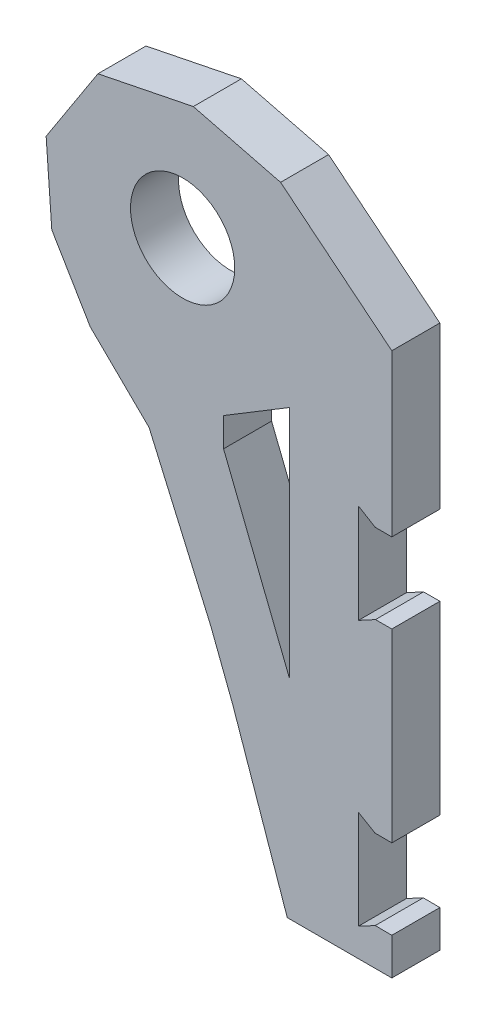
ISO-10303-21;
HEADER;
FILE_DESCRIPTION(('STEP AP214'),'2;1');
FILE_NAME('part.step','',(''),(''),'','','');
FILE_SCHEMA(('AUTOMOTIVE_DESIGN { 1 0 10303 214 1 1 1 1 }'));
ENDSEC;
DATA;
#1=APPLICATION_CONTEXT('core data for automotive mechanical design processes');
#2=APPLICATION_PROTOCOL_DEFINITION('international standard','automotive_design',2000,#1);
#3=PRODUCT_CONTEXT('',#1,'mechanical');
#4=PRODUCT('Part','Part','',(#3));
#5=PRODUCT_RELATED_PRODUCT_CATEGORY('part','',(#4));
#6=PRODUCT_DEFINITION_FORMATION('','',#4);
#7=PRODUCT_DEFINITION_CONTEXT('part definition',#1,'design');
#8=PRODUCT_DEFINITION('design','',#6,#7);
#9=PRODUCT_DEFINITION_SHAPE('','',#8);
#10=(LENGTH_UNIT() NAMED_UNIT(*) SI_UNIT(.MILLI.,.METRE.));
#11=(NAMED_UNIT(*) PLANE_ANGLE_UNIT() SI_UNIT($,.RADIAN.));
#12=(NAMED_UNIT(*) SI_UNIT($,.STERADIAN.) SOLID_ANGLE_UNIT());
#13=UNCERTAINTY_MEASURE_WITH_UNIT(LENGTH_MEASURE(1.E-05),#10,'distance_accuracy_value','');
#14=(GEOMETRIC_REPRESENTATION_CONTEXT(3) GLOBAL_UNCERTAINTY_ASSIGNED_CONTEXT((#13)) GLOBAL_UNIT_ASSIGNED_CONTEXT((#10,
#11,#12)) REPRESENTATION_CONTEXT('',''));
#15=CARTESIAN_POINT('',(0.,0.,0.));
#16=DIRECTION('',(0.,0.,1.));
#17=DIRECTION('',(1.,0.,0.));
#18=AXIS2_PLACEMENT_3D('',#15,#16,#17);
#19=CARTESIAN_POINT('',(0.,0.,7.5));
#20=DIRECTION('',(0.,0.,-1.));
#21=DIRECTION('',(-1.,0.,0.));
#22=AXIS2_PLACEMENT_3D('',#19,#20,#21);
#23=PLANE('',#22);
#24=CARTESIAN_POINT('',(-5.68408738774668,32.5811370971305,7.5));
#25=DIRECTION('',(0.,0.,1.));
#26=DIRECTION('',(1.,0.,0.));
#27=AXIS2_PLACEMENT_3D('',#24,#25,#26);
#28=CIRCLE('',#27,8.13742907248552);
#29=CARTESIAN_POINT('',(2.45334168473884,32.5811370971305,7.5));
#30=VERTEX_POINT('',#29);
#31=EDGE_CURVE('E273',#30,#30,#28,.T.);
#32=ORIENTED_EDGE('',*,*,#31,.F.);
#33=EDGE_LOOP('',(#32));
#34=FACE_BOUND('',#33,.T.);
#35=DIRECTION('',(0.327786783060112,-0.944751726566881,0.));
#36=VECTOR('',#35,1.);
#37=CARTESIAN_POINT('',(2.14088005113396,-26.5918462657992,7.5));
#38=LINE('',#37,#36);
#39=CARTESIAN_POINT('',(2.14088005113396,-26.5918462657992,7.5));
#40=VERTEX_POINT('',#39);
#41=CARTESIAN_POINT('',(10.6557421116808,-51.1335027599393,7.5));
#42=VERTEX_POINT('',#41);
#43=EDGE_CURVE('E281',#40,#42,#38,.T.);
#44=ORIENTED_EDGE('',*,*,#43,.T.);
#45=DIRECTION('',(0.999999998629275,5.23588661773342E-05,0.));
#46=VECTOR('',#45,1.);
#47=CARTESIAN_POINT('',(10.6557421116808,-51.1335027599393,7.5));
#48=LINE('',#47,#46);
#49=CARTESIAN_POINT('',(26.9756559758166,-51.1326482677521,7.5));
#50=VERTEX_POINT('',#49);
#51=EDGE_CURVE('E285',#42,#50,#48,.T.);
#52=ORIENTED_EDGE('',*,*,#51,.T.);
#53=DIRECTION('',(0.,1.,0.));
#54=VECTOR('',#53,1.);
#55=CARTESIAN_POINT('',(26.9756559758166,-51.1326482677521,7.5));
#56=LINE('',#55,#54);
#57=CARTESIAN_POINT('',(26.9756559758166,-45.3559755781739,7.5));
#58=VERTEX_POINT('',#57);
#59=EDGE_CURVE('E289',#50,#58,#56,.T.);
#60=ORIENTED_EDGE('',*,*,#59,.T.);
#61=DIRECTION('',(-0.999977554959062,0.00669996851457697,0.));
#62=VECTOR('',#61,1.);
#63=CARTESIAN_POINT('',(24.3816338362474,-45.3385953214121,7.5));
#64=LINE('',#63,#62);
#65=CARTESIAN_POINT('',(24.3816338362474,-45.3385953214121,7.5));
#66=VERTEX_POINT('',#65);
#67=EDGE_CURVE('E292',#58,#66,#64,.T.);
#68=ORIENTED_EDGE('',*,*,#67,.T.);
#69=DIRECTION('',(-0.881650799771795,-0.471902391667762,0.));
#70=VECTOR('',#69,1.);
#71=CARTESIAN_POINT('',(21.7548112223684,-46.7445985534143,7.5));
#72=LINE('',#71,#70);
#73=CARTESIAN_POINT('',(21.7548112223684,-46.7445985534143,7.5));
#74=VERTEX_POINT('',#73);
#75=EDGE_CURVE('E295',#66,#74,#72,.T.);
#76=ORIENTED_EDGE('',*,*,#75,.T.);
#77=DIRECTION('',(0.,1.,0.));
#78=VECTOR('',#77,1.);
#79=CARTESIAN_POINT('',(21.7548112223684,-46.7445985534143,7.5));
#80=LINE('',#79,#78);
#81=CARTESIAN_POINT('',(21.7548112223684,-31.3357452492507,7.5));
#82=VERTEX_POINT('',#81);
#83=EDGE_CURVE('E298',#74,#82,#80,.T.);
#84=ORIENTED_EDGE('',*,*,#83,.T.);
#85=DIRECTION('',(0.86333264245163,-0.504635262816112,0.));
#86=VECTOR('',#85,1.);
#87=CARTESIAN_POINT('',(24.3411100561521,-32.8474888432392,7.5));
#88=LINE('',#87,#86);
#89=CARTESIAN_POINT('',(24.3411100561521,-32.8474888432392,7.5));
#90=VERTEX_POINT('',#89);
#91=EDGE_CURVE('E301',#82,#90,#88,.T.);
#92=ORIENTED_EDGE('',*,*,#91,.T.);
#93=DIRECTION('',(0.999977232492615,-0.00674792534127332,0.));
#94=VECTOR('',#93,1.);
#95=CARTESIAN_POINT('',(26.9756559758166,-32.8652669671768,7.5));
#96=LINE('',#95,#94);
#97=CARTESIAN_POINT('',(26.9756559758166,-32.8652669671768,7.5));
#98=VERTEX_POINT('',#97);
#99=EDGE_CURVE('E304',#90,#98,#96,.T.);
#100=ORIENTED_EDGE('',*,*,#99,.T.);
#101=DIRECTION('',(0.,1.,0.));
#102=VECTOR('',#101,1.);
#103=CARTESIAN_POINT('',(26.9756559758166,-32.8652669671768,7.5));
#104=LINE('',#103,#102);
#105=CARTESIAN_POINT('',(26.9756559758166,-3.94984417987594,7.5));
#106=VERTEX_POINT('',#105);
#107=EDGE_CURVE('E307',#98,#106,#104,.T.);
#108=ORIENTED_EDGE('',*,*,#107,.T.);
#109=DIRECTION('',(-0.999999388687397,-0.00110572366889423,0.));
#110=VECTOR('',#109,1.);
#111=CARTESIAN_POINT('',(26.9756559758166,-3.94984417987594,7.5));
#112=LINE('',#111,#110);
#113=CARTESIAN_POINT('',(24.4233959688515,-3.9526662759,7.5));
#114=VERTEX_POINT('',#113);
#115=EDGE_CURVE('E310',#106,#114,#112,.T.);
#116=ORIENTED_EDGE('',*,*,#115,.T.);
#117=DIRECTION('',(-0.87910887625359,-0.476621006347967,0.));
#118=VECTOR('',#117,1.);
#119=CARTESIAN_POINT('',(24.4233959688515,-3.9526662759,7.5));
#120=LINE('',#119,#118);
#121=CARTESIAN_POINT('',(21.7548112223684,-5.39947631473605,7.5));
#122=VERTEX_POINT('',#121);
#123=EDGE_CURVE('E313',#114,#122,#120,.T.);
#124=ORIENTED_EDGE('',*,*,#123,.T.);
#125=DIRECTION('',(0.,1.,0.));
#126=VECTOR('',#125,1.);
#127=CARTESIAN_POINT('',(21.7548112223684,-5.39947631473605,7.5));
#128=LINE('',#127,#126);
#129=CARTESIAN_POINT('',(21.7548112223684,10.0788262193875,7.5));
#130=VERTEX_POINT('',#129);
#131=EDGE_CURVE('E316',#122,#130,#128,.T.);
#132=ORIENTED_EDGE('',*,*,#131,.T.);
#133=DIRECTION('',(0.857491472658997,-0.514498177175687,0.));
#134=VECTOR('',#133,1.);
#135=CARTESIAN_POINT('',(21.7548112223684,10.0788262193875,7.5));
#136=LINE('',#135,#134);
#137=CARTESIAN_POINT('',(24.3888496995734,8.4983930158593,7.5));
#138=VERTEX_POINT('',#137);
#139=EDGE_CURVE('E319',#130,#138,#136,.T.);
#140=ORIENTED_EDGE('',*,*,#139,.T.);
#141=DIRECTION('',(0.999999491448022,0.00100851559114491,0.));
#142=VECTOR('',#141,1.);
#143=CARTESIAN_POINT('',(24.3888496995734,8.4983930158593,7.5));
#144=LINE('',#143,#142);
#145=CARTESIAN_POINT('',(26.9756559758166,8.50100185164689,7.5));
#146=VERTEX_POINT('',#145);
#147=EDGE_CURVE('E322',#138,#146,#144,.T.);
#148=ORIENTED_EDGE('',*,*,#147,.T.);
#149=DIRECTION('',(0.,1.,0.));
#150=VECTOR('',#149,1.);
#151=CARTESIAN_POINT('',(26.9756559758166,8.50100185164689,7.5));
#152=LINE('',#151,#150);
#153=CARTESIAN_POINT('',(26.9756559758166,33.6680566883023,7.5));
#154=VERTEX_POINT('',#153);
#155=EDGE_CURVE('E325',#146,#154,#152,.T.);
#156=ORIENTED_EDGE('',*,*,#155,.T.);
#157=DIRECTION('',(-0.776679969763153,0.629895407642179,0.));
#158=VECTOR('',#157,1.);
#159=CARTESIAN_POINT('',(26.9756559758166,33.6680566883023,7.5));
#160=LINE('',#159,#158);
#161=CARTESIAN_POINT('',(9.60776084947388,47.7535974597868,7.5));
#162=VERTEX_POINT('',#161);
#163=EDGE_CURVE('E328',#154,#162,#160,.T.);
#164=ORIENTED_EDGE('',*,*,#163,.T.);
#165=DIRECTION('',(-0.969638367485798,0.244543321927784,0.));
#166=VECTOR('',#165,1.);
#167=CARTESIAN_POINT('',(9.60776084947388,47.7535974597868,7.5));
#168=LINE('',#167,#166);
#169=CARTESIAN_POINT('',(-4.01125389051643,51.1883203601773,7.5));
#170=VERTEX_POINT('',#169);
#171=EDGE_CURVE('E331',#162,#170,#168,.T.);
#172=ORIENTED_EDGE('',*,*,#171,.T.);
#173=DIRECTION('',(-0.980171583001799,-0.198150619165694,0.));
#174=VECTOR('',#173,1.);
#175=CARTESIAN_POINT('',(-4.01125389051643,51.1883203601773,7.5));
#176=LINE('',#175,#174);
#177=CARTESIAN_POINT('',(-18.9029794306775,48.1778223133031,7.5));
#178=VERTEX_POINT('',#177);
#179=EDGE_CURVE('E334',#170,#178,#176,.T.);
#180=ORIENTED_EDGE('',*,*,#179,.T.);
#181=DIRECTION('',(-0.543501627566588,-0.839408113394474,0.));
#182=VECTOR('',#181,1.);
#183=CARTESIAN_POINT('',(-18.9029794306775,48.1778223133031,7.5));
#184=LINE('',#183,#182);
#185=CARTESIAN_POINT('',(-26.9900823206922,35.6877405261928,7.5));
#186=VERTEX_POINT('',#185);
#187=EDGE_CURVE('E337',#178,#186,#184,.T.);
#188=ORIENTED_EDGE('',*,*,#187,.T.);
#189=DIRECTION('',(0.0721951133905019,-0.997390528129545,0.));
#190=VECTOR('',#189,1.);
#191=CARTESIAN_POINT('',(-26.9900823206922,35.6877405261928,7.5));
#192=LINE('',#191,#190);
#193=CARTESIAN_POINT('',(-26.1062942118665,23.4780237293178,7.5));
#194=VERTEX_POINT('',#193);
#195=EDGE_CURVE('E340',#186,#194,#192,.T.);
#196=ORIENTED_EDGE('',*,*,#195,.T.);
#197=DIRECTION('',(0.51044203392925,-0.859912164118039,0.));
#198=VECTOR('',#197,1.);
#199=CARTESIAN_POINT('',(-26.1062942118665,23.4780237293178,7.5));
#200=LINE('',#199,#198);
#201=CARTESIAN_POINT('',(-20.0964055628797,13.353512010569,7.5));
#202=VERTEX_POINT('',#201);
#203=EDGE_CURVE('E343',#194,#202,#200,.T.);
#204=ORIENTED_EDGE('',*,*,#203,.T.);
#205=DIRECTION('',(0.713636565230956,-0.700516133122831,0.));
#206=VECTOR('',#205,1.);
#207=CARTESIAN_POINT('',(-20.0964055628797,13.353512010569,7.5));
#208=LINE('',#207,#206);
#209=CARTESIAN_POINT('',(-10.9140039057752,4.3399316883026,7.5));
#210=VERTEX_POINT('',#209);
#211=EDGE_CURVE('E346',#202,#210,#208,.T.);
#212=ORIENTED_EDGE('',*,*,#211,.T.);
#213=DIRECTION('',(0.400696997204271,-0.916210628857514,0.));
#214=VECTOR('',#213,1.);
#215=CARTESIAN_POINT('',(-10.9140039057752,4.3399316883026,7.5));
#216=LINE('',#215,#214);
#217=CARTESIAN_POINT('',(-1.27593284559459,-17.6979253673613,7.5));
#218=VERTEX_POINT('',#217);
#219=EDGE_CURVE('E349',#210,#218,#216,.T.);
#220=ORIENTED_EDGE('',*,*,#219,.T.);
#221=DIRECTION('',(0.358620098773192,-0.9334835964043,0.));
#222=VECTOR('',#221,1.);
#223=CARTESIAN_POINT('',(-1.27593284559459,-17.6979253673613,7.5));
#224=LINE('',#223,#222);
#225=EDGE_CURVE('E352',#218,#40,#224,.T.);
#226=ORIENTED_EDGE('',*,*,#225,.T.);
#227=EDGE_LOOP('',(#44,#52,#60,#68,#76,#84,#92,#100,#108,#116,#124,#132,#140,#148,#156,#164,
#172,#180,#188,#196,#204,#212,#220,#226));
#228=FACE_BOUND('',#227,.T.);
#229=DIRECTION('',(0.369441658914223,-0.929253926899804,0.));
#230=VECTOR('',#229,1.);
#231=CARTESIAN_POINT('',(11.0169248580933,-18.6592245318652,7.5));
#232=LINE('',#231,#230);
#233=CARTESIAN_POINT('',(0.706809043884313,7.27373504638833,7.5));
#234=VERTEX_POINT('',#233);
#235=CARTESIAN_POINT('',(11.0169248580933,-18.6592245318652,7.5));
#236=VERTEX_POINT('',#235);
#237=EDGE_CURVE('E225',#234,#236,#232,.T.);
#238=ORIENTED_EDGE('',*,*,#237,.F.);
#239=DIRECTION('',(0.,-1.,0.));
#240=VECTOR('',#239,1.);
#241=CARTESIAN_POINT('',(0.706809043884313,7.27373504638833,7.5));
#242=LINE('',#241,#240);
#243=CARTESIAN_POINT('',(0.706809043884313,11.7755355834972,7.5));
#244=VERTEX_POINT('',#243);
#245=EDGE_CURVE('E251',#244,#234,#242,.T.);
#246=ORIENTED_EDGE('',*,*,#245,.F.);
#247=DIRECTION('',(-0.855471182872882,-0.517850417856423,0.));
#248=VECTOR('',#247,1.);
#249=CARTESIAN_POINT('',(0.706809043884313,11.7755355834972,7.5));
#250=LINE('',#249,#248);
#251=CARTESIAN_POINT('',(11.0169248580933,18.0166549682627,7.5));
#252=VERTEX_POINT('',#251);
#253=EDGE_CURVE('E247',#252,#244,#250,.T.);
#254=ORIENTED_EDGE('',*,*,#253,.F.);
#255=DIRECTION('',(0.,1.,0.));
#256=VECTOR('',#255,1.);
#257=CARTESIAN_POINT('',(11.0169248580933,18.0166549682627,7.5));
#258=LINE('',#257,#256);
#259=EDGE_CURVE('E234',#236,#252,#258,.T.);
#260=ORIENTED_EDGE('',*,*,#259,.F.);
#261=EDGE_LOOP('',(#238,#246,#254,#260));
#262=FACE_BOUND('',#261,.T.);
#263=ADVANCED_FACE('F39',(#34,#228,#262),#23,.F.);
#264=CARTESIAN_POINT('',(0.,0.,0.));
#265=DIRECTION('',(0.,0.,-1.));
#266=DIRECTION('',(-1.,0.,0.));
#267=AXIS2_PLACEMENT_3D('',#264,#265,#266);
#268=PLANE('',#267);
#269=DIRECTION('',(0.327786783060112,-0.944751726566881,0.));
#270=VECTOR('',#269,1.);
#271=CARTESIAN_POINT('',(2.14088005113396,-26.5918462657992,0.));
#272=LINE('',#271,#270);
#273=CARTESIAN_POINT('',(2.14088005113396,-26.5918462657992,0.));
#274=VERTEX_POINT('',#273);
#275=CARTESIAN_POINT('',(10.6557421116808,-51.1335027599393,0.));
#276=VERTEX_POINT('',#275);
#277=EDGE_CURVE('E277',#274,#276,#272,.T.);
#278=ORIENTED_EDGE('',*,*,#277,.F.);
#279=DIRECTION('',(0.358620098773192,-0.9334835964043,0.));
#280=VECTOR('',#279,1.);
#281=CARTESIAN_POINT('',(-1.27593284559459,-17.6979253673613,0.));
#282=LINE('',#281,#280);
#283=CARTESIAN_POINT('',(-1.27593284559459,-17.6979253673613,0.));
#284=VERTEX_POINT('',#283);
#285=EDGE_CURVE('E286',#284,#274,#282,.T.);
#286=ORIENTED_EDGE('',*,*,#285,.F.);
#287=DIRECTION('',(0.400696997204271,-0.916210628857514,0.));
#288=VECTOR('',#287,1.);
#289=CARTESIAN_POINT('',(-10.9140039057752,4.3399316883026,0.));
#290=LINE('',#289,#288);
#291=CARTESIAN_POINT('',(-10.9140039057752,4.3399316883026,0.));
#292=VERTEX_POINT('',#291);
#293=EDGE_CURVE('E423',#292,#284,#290,.T.);
#294=ORIENTED_EDGE('',*,*,#293,.F.);
#295=DIRECTION('',(0.713636565230956,-0.700516133122831,0.));
#296=VECTOR('',#295,1.);
#297=CARTESIAN_POINT('',(-20.0964055628797,13.353512010569,0.));
#298=LINE('',#297,#296);
#299=CARTESIAN_POINT('',(-20.0964055628797,13.353512010569,0.));
#300=VERTEX_POINT('',#299);
#301=EDGE_CURVE('E420',#300,#292,#298,.T.);
#302=ORIENTED_EDGE('',*,*,#301,.F.);
#303=DIRECTION('',(0.51044203392925,-0.859912164118039,0.));
#304=VECTOR('',#303,1.);
#305=CARTESIAN_POINT('',(-26.1062942118665,23.4780237293178,0.));
#306=LINE('',#305,#304);
#307=CARTESIAN_POINT('',(-26.1062942118665,23.4780237293178,0.));
#308=VERTEX_POINT('',#307);
#309=EDGE_CURVE('E417',#308,#300,#306,.T.);
#310=ORIENTED_EDGE('',*,*,#309,.F.);
#311=DIRECTION('',(0.0721951133905019,-0.997390528129545,0.));
#312=VECTOR('',#311,1.);
#313=CARTESIAN_POINT('',(-26.9900823206922,35.6877405261928,0.));
#314=LINE('',#313,#312);
#315=CARTESIAN_POINT('',(-26.9900823206922,35.6877405261928,0.));
#316=VERTEX_POINT('',#315);
#317=EDGE_CURVE('E414',#316,#308,#314,.T.);
#318=ORIENTED_EDGE('',*,*,#317,.F.);
#319=DIRECTION('',(-0.543501627566588,-0.839408113394474,0.));
#320=VECTOR('',#319,1.);
#321=CARTESIAN_POINT('',(-18.9029794306775,48.1778223133031,0.));
#322=LINE('',#321,#320);
#323=CARTESIAN_POINT('',(-18.9029794306775,48.1778223133031,0.));
#324=VERTEX_POINT('',#323);
#325=EDGE_CURVE('E411',#324,#316,#322,.T.);
#326=ORIENTED_EDGE('',*,*,#325,.F.);
#327=DIRECTION('',(-0.980171583001799,-0.198150619165694,0.));
#328=VECTOR('',#327,1.);
#329=CARTESIAN_POINT('',(-4.01125389051643,51.1883203601773,0.));
#330=LINE('',#329,#328);
#331=CARTESIAN_POINT('',(-4.01125389051643,51.1883203601773,0.));
#332=VERTEX_POINT('',#331);
#333=EDGE_CURVE('E408',#332,#324,#330,.T.);
#334=ORIENTED_EDGE('',*,*,#333,.F.);
#335=DIRECTION('',(-0.969638367485798,0.244543321927784,0.));
#336=VECTOR('',#335,1.);
#337=CARTESIAN_POINT('',(9.60776084947388,47.7535974597868,0.));
#338=LINE('',#337,#336);
#339=CARTESIAN_POINT('',(9.60776084947388,47.7535974597868,0.));
#340=VERTEX_POINT('',#339);
#341=EDGE_CURVE('E405',#340,#332,#338,.T.);
#342=ORIENTED_EDGE('',*,*,#341,.F.);
#343=DIRECTION('',(-0.776679969763153,0.629895407642179,0.));
#344=VECTOR('',#343,1.);
#345=CARTESIAN_POINT('',(26.9756559758166,33.6680566883023,0.));
#346=LINE('',#345,#344);
#347=CARTESIAN_POINT('',(26.9756559758166,33.6680566883023,0.));
#348=VERTEX_POINT('',#347);
#349=EDGE_CURVE('E402',#348,#340,#346,.T.);
#350=ORIENTED_EDGE('',*,*,#349,.F.);
#351=DIRECTION('',(0.,1.,0.));
#352=VECTOR('',#351,1.);
#353=CARTESIAN_POINT('',(26.9756559758166,14.337546700091,0.));
#354=LINE('',#353,#352);
#355=CARTESIAN_POINT('',(26.9756559758166,8.50100185164689,0.));
#356=VERTEX_POINT('',#355);
#357=EDGE_CURVE('E399',#356,#348,#354,.T.);
#358=ORIENTED_EDGE('',*,*,#357,.F.);
#359=DIRECTION('',(0.999999491448022,0.00100851559114491,0.));
#360=VECTOR('',#359,1.);
#361=CARTESIAN_POINT('',(24.3888496995734,8.4983930158593,0.));
#362=LINE('',#361,#360);
#363=CARTESIAN_POINT('',(24.3888496995734,8.4983930158593,0.));
#364=VERTEX_POINT('',#363);
#365=EDGE_CURVE('E395',#364,#356,#362,.T.);
#366=ORIENTED_EDGE('',*,*,#365,.F.);
#367=DIRECTION('',(0.857491472658997,-0.514498177175687,0.));
#368=VECTOR('',#367,1.);
#369=CARTESIAN_POINT('',(21.7548112223684,10.0788262193875,0.));
#370=LINE('',#369,#368);
#371=CARTESIAN_POINT('',(21.7548112223684,10.0788262193875,0.));
#372=VERTEX_POINT('',#371);
#373=EDGE_CURVE('E392',#372,#364,#370,.T.);
#374=ORIENTED_EDGE('',*,*,#373,.F.);
#375=DIRECTION('',(0.,1.,0.));
#376=VECTOR('',#375,1.);
#377=CARTESIAN_POINT('',(21.7548112223684,-5.39947631473605,0.));
#378=LINE('',#377,#376);
#379=CARTESIAN_POINT('',(21.7548112223684,-5.39947631473605,0.));
#380=VERTEX_POINT('',#379);
#381=EDGE_CURVE('E389',#380,#372,#378,.T.);
#382=ORIENTED_EDGE('',*,*,#381,.F.);
#383=DIRECTION('',(-0.87910887625359,-0.476621006347967,0.));
#384=VECTOR('',#383,1.);
#385=CARTESIAN_POINT('',(24.4233959688515,-3.9526662759,0.));
#386=LINE('',#385,#384);
#387=CARTESIAN_POINT('',(24.4233959688515,-3.9526662759,0.));
#388=VERTEX_POINT('',#387);
#389=EDGE_CURVE('E386',#388,#380,#386,.T.);
#390=ORIENTED_EDGE('',*,*,#389,.F.);
#391=DIRECTION('',(-0.999999388687397,-0.00110572366889423,0.));
#392=VECTOR('',#391,1.);
#393=CARTESIAN_POINT('',(26.9756559758166,-3.94984417987594,0.));
#394=LINE('',#393,#392);
#395=CARTESIAN_POINT('',(26.9756559758166,-3.94984417987594,0.));
#396=VERTEX_POINT('',#395);
#397=EDGE_CURVE('E383',#396,#388,#394,.T.);
#398=ORIENTED_EDGE('',*,*,#397,.F.);
#399=DIRECTION('',(0.,1.,0.));
#400=VECTOR('',#399,1.);
#401=CARTESIAN_POINT('',(26.9756559758166,-32.8652669671768,0.));
#402=LINE('',#401,#400);
#403=CARTESIAN_POINT('',(26.9756559758166,-32.8652669671768,0.));
#404=VERTEX_POINT('',#403);
#405=EDGE_CURVE('E380',#404,#396,#402,.T.);
#406=ORIENTED_EDGE('',*,*,#405,.F.);
#407=DIRECTION('',(0.999977232492615,-0.00674792534127332,0.));
#408=VECTOR('',#407,1.);
#409=CARTESIAN_POINT('',(26.9756559758166,-32.8652669671768,0.));
#410=LINE('',#409,#408);
#411=CARTESIAN_POINT('',(24.3411100561521,-32.8474888432392,0.));
#412=VERTEX_POINT('',#411);
#413=EDGE_CURVE('E377',#412,#404,#410,.T.);
#414=ORIENTED_EDGE('',*,*,#413,.F.);
#415=DIRECTION('',(0.86333264245163,-0.504635262816112,0.));
#416=VECTOR('',#415,1.);
#417=CARTESIAN_POINT('',(24.3411100561521,-32.8474888432392,0.));
#418=LINE('',#417,#416);
#419=CARTESIAN_POINT('',(21.7548112223684,-31.3357452492507,0.));
#420=VERTEX_POINT('',#419);
#421=EDGE_CURVE('E374',#420,#412,#418,.T.);
#422=ORIENTED_EDGE('',*,*,#421,.F.);
#423=DIRECTION('',(0.,1.,0.));
#424=VECTOR('',#423,1.);
#425=CARTESIAN_POINT('',(21.7548112223684,-46.7445985534143,0.));
#426=LINE('',#425,#424);
#427=CARTESIAN_POINT('',(21.7548112223684,-46.7445985534143,0.));
#428=VERTEX_POINT('',#427);
#429=EDGE_CURVE('E371',#428,#420,#426,.T.);
#430=ORIENTED_EDGE('',*,*,#429,.F.);
#431=DIRECTION('',(-0.881650799771795,-0.471902391667762,0.));
#432=VECTOR('',#431,1.);
#433=CARTESIAN_POINT('',(21.7548112223684,-46.7445985534143,0.));
#434=LINE('',#433,#432);
#435=CARTESIAN_POINT('',(24.3816338362474,-45.3385953214121,0.));
#436=VERTEX_POINT('',#435);
#437=EDGE_CURVE('E368',#436,#428,#434,.T.);
#438=ORIENTED_EDGE('',*,*,#437,.F.);
#439=DIRECTION('',(-0.999977554959062,0.00669996851457697,0.));
#440=VECTOR('',#439,1.);
#441=CARTESIAN_POINT('',(24.3816338362474,-45.3385953214121,0.));
#442=LINE('',#441,#440);
#443=CARTESIAN_POINT('',(26.9756559758166,-45.3559755781739,0.));
#444=VERTEX_POINT('',#443);
#445=EDGE_CURVE('E365',#444,#436,#442,.T.);
#446=ORIENTED_EDGE('',*,*,#445,.F.);
#447=DIRECTION('',(0.,1.,0.));
#448=VECTOR('',#447,1.);
#449=CARTESIAN_POINT('',(26.9756559758166,-51.1326482677521,0.));
#450=LINE('',#449,#448);
#451=CARTESIAN_POINT('',(26.9756559758166,-51.1326482677521,0.));
#452=VERTEX_POINT('',#451);
#453=EDGE_CURVE('E362',#452,#444,#450,.T.);
#454=ORIENTED_EDGE('',*,*,#453,.F.);
#455=DIRECTION('',(0.999999998629275,5.23588661773342E-05,0.));
#456=VECTOR('',#455,1.);
#457=CARTESIAN_POINT('',(10.6557421116808,-51.1335027599393,0.));
#458=LINE('',#457,#456);
#459=EDGE_CURVE('E359',#276,#452,#458,.T.);
#460=ORIENTED_EDGE('',*,*,#459,.F.);
#461=EDGE_LOOP('',(#278,#286,#294,#302,#310,#318,#326,#334,#342,#350,#358,#366,#374,#382,#390,
#398,#406,#414,#422,#430,#438,#446,#454,#460));
#462=FACE_BOUND('',#461,.T.);
#463=CARTESIAN_POINT('',(-5.68408738774668,32.5811370971305,0.));
#464=DIRECTION('',(0.,0.,1.));
#465=DIRECTION('',(1.,0.,0.));
#466=AXIS2_PLACEMENT_3D('',#463,#464,#465);
#467=CIRCLE('',#466,8.13742907248552);
#468=CARTESIAN_POINT('',(2.45334168473884,32.5811370971305,0.));
#469=VERTEX_POINT('',#468);
#470=EDGE_CURVE('E243',#469,#469,#467,.T.);
#471=ORIENTED_EDGE('',*,*,#470,.T.);
#472=EDGE_LOOP('',(#471));
#473=FACE_BOUND('',#472,.T.);
#474=DIRECTION('',(0.,-1.,0.));
#475=VECTOR('',#474,1.);
#476=CARTESIAN_POINT('',(0.706809043884313,7.27373504638833,0.));
#477=LINE('',#476,#475);
#478=CARTESIAN_POINT('',(0.706809043884313,11.7755355834972,0.));
#479=VERTEX_POINT('',#478);
#480=CARTESIAN_POINT('',(0.706809043884313,7.27373504638833,0.));
#481=VERTEX_POINT('',#480);
#482=EDGE_CURVE('E235',#479,#481,#477,.T.);
#483=ORIENTED_EDGE('',*,*,#482,.T.);
#484=DIRECTION('',(0.369441658914223,-0.929253926899804,0.));
#485=VECTOR('',#484,1.);
#486=CARTESIAN_POINT('',(11.0169248580933,-18.6592245318652,0.));
#487=LINE('',#486,#485);
#488=CARTESIAN_POINT('',(11.0169248580933,-18.6592245318652,0.));
#489=VERTEX_POINT('',#488);
#490=EDGE_CURVE('E63',#481,#489,#487,.T.);
#491=ORIENTED_EDGE('',*,*,#490,.T.);
#492=DIRECTION('',(0.,1.,0.));
#493=VECTOR('',#492,1.);
#494=CARTESIAN_POINT('',(11.0169248580933,18.0166549682627,0.));
#495=LINE('',#494,#493);
#496=CARTESIAN_POINT('',(11.0169248580933,18.0166549682627,0.));
#497=VERTEX_POINT('',#496);
#498=EDGE_CURVE('E241',#489,#497,#495,.T.);
#499=ORIENTED_EDGE('',*,*,#498,.T.);
#500=DIRECTION('',(-0.855471182872882,-0.517850417856423,0.));
#501=VECTOR('',#500,1.);
#502=CARTESIAN_POINT('',(0.706809043884313,11.7755355834972,0.));
#503=LINE('',#502,#501);
#504=EDGE_CURVE('E260',#497,#479,#503,.T.);
#505=ORIENTED_EDGE('',*,*,#504,.T.);
#506=EDGE_LOOP('',(#483,#491,#499,#505));
#507=FACE_BOUND('',#506,.T.);
#508=ADVANCED_FACE('F526',(#462,#473,#507),#268,.T.);
#509=CARTESIAN_POINT('',(2.14088005113396,-26.5918462657992,7.5));
#510=DIRECTION('',(0.944751726566881,0.327786783060112,0.));
#511=DIRECTION('',(-0.327786783060112,0.944751726566881,0.));
#512=AXIS2_PLACEMENT_3D('',#509,#510,#511);
#513=PLANE('',#512);
#514=ORIENTED_EDGE('',*,*,#277,.T.);
#515=DIRECTION('',(0.,0.,-1.));
#516=VECTOR('',#515,1.);
#517=CARTESIAN_POINT('',(10.6557421116808,-51.1335027599393,7.5));
#518=LINE('',#517,#516);
#519=EDGE_CURVE('E11',#42,#276,#518,.T.);
#520=ORIENTED_EDGE('',*,*,#519,.F.);
#521=ORIENTED_EDGE('',*,*,#43,.F.);
#522=DIRECTION('',(0.,0.,-1.));
#523=VECTOR('',#522,1.);
#524=CARTESIAN_POINT('',(2.14088005113396,-26.5918462657992,7.5));
#525=LINE('',#524,#523);
#526=EDGE_CURVE('E355',#40,#274,#525,.T.);
#527=ORIENTED_EDGE('',*,*,#526,.T.);
#528=EDGE_LOOP('',(#514,#520,#521,#527));
#529=FACE_BOUND('',#528,.T.);
#530=ADVANCED_FACE('F41',(#529),#513,.F.);
#531=CARTESIAN_POINT('',(10.6557421116808,-51.1335027599393,7.5));
#532=DIRECTION('',(-5.23588661773342E-05,0.999999998629275,0.));
#533=DIRECTION('',(-0.999999998629275,-5.23588661773342E-05,0.));
#534=AXIS2_PLACEMENT_3D('',#531,#532,#533);
#535=PLANE('',#534);
#536=ORIENTED_EDGE('',*,*,#459,.T.);
#537=DIRECTION('',(0.,0.,-1.));
#538=VECTOR('',#537,1.);
#539=CARTESIAN_POINT('',(26.9756559758166,-51.1326482677521,7.5));
#540=LINE('',#539,#538);
#541=EDGE_CURVE('E48',#50,#452,#540,.T.);
#542=ORIENTED_EDGE('',*,*,#541,.F.);
#543=ORIENTED_EDGE('',*,*,#51,.F.);
#544=ORIENTED_EDGE('',*,*,#519,.T.);
#545=EDGE_LOOP('',(#536,#542,#543,#544));
#546=FACE_BOUND('',#545,.T.);
#547=ADVANCED_FACE('F543',(#546),#535,.F.);
#548=CARTESIAN_POINT('',(26.9756559758166,-51.1326482677521,7.5));
#549=DIRECTION('',(-1.,0.,0.));
#550=DIRECTION('',(0.,-1.,0.));
#551=AXIS2_PLACEMENT_3D('',#548,#549,#550);
#552=PLANE('',#551);
#553=ORIENTED_EDGE('',*,*,#453,.T.);
#554=DIRECTION('',(0.,0.,-1.));
#555=VECTOR('',#554,1.);
#556=CARTESIAN_POINT('',(26.9756559758166,-45.3559755781739,7.5));
#557=LINE('',#556,#555);
#558=EDGE_CURVE('E511',#58,#444,#557,.T.);
#559=ORIENTED_EDGE('',*,*,#558,.F.);
#560=ORIENTED_EDGE('',*,*,#59,.F.);
#561=ORIENTED_EDGE('',*,*,#541,.T.);
#562=EDGE_LOOP('',(#553,#559,#560,#561));
#563=FACE_BOUND('',#562,.T.);
#564=ADVANCED_FACE('F520',(#563),#552,.F.);
#565=CARTESIAN_POINT('',(24.3816338362474,-45.3385953214121,7.5));
#566=DIRECTION('',(-0.00669996851457697,-0.999977554959062,0.));
#567=DIRECTION('',(0.999977554959062,-0.00669996851457697,0.));
#568=AXIS2_PLACEMENT_3D('',#565,#566,#567);
#569=PLANE('',#568);
#570=ORIENTED_EDGE('',*,*,#445,.T.);
#571=DIRECTION('',(0.,0.,-1.));
#572=VECTOR('',#571,1.);
#573=CARTESIAN_POINT('',(24.3816338362474,-45.3385953214121,7.5));
#574=LINE('',#573,#572);
#575=EDGE_CURVE('E507',#66,#436,#574,.T.);
#576=ORIENTED_EDGE('',*,*,#575,.F.);
#577=ORIENTED_EDGE('',*,*,#67,.F.);
#578=ORIENTED_EDGE('',*,*,#558,.T.);
#579=EDGE_LOOP('',(#570,#576,#577,#578));
#580=FACE_BOUND('',#579,.T.);
#581=ADVANCED_FACE('F532',(#580),#569,.F.);
#582=CARTESIAN_POINT('',(21.7548112223684,-46.7445985534143,7.5));
#583=DIRECTION('',(0.471902391667762,-0.881650799771795,0.));
#584=DIRECTION('',(0.881650799771796,0.471902391667762,0.));
#585=AXIS2_PLACEMENT_3D('',#582,#583,#584);
#586=PLANE('',#585);
#587=ORIENTED_EDGE('',*,*,#437,.T.);
#588=DIRECTION('',(0.,0.,-1.));
#589=VECTOR('',#588,1.);
#590=CARTESIAN_POINT('',(21.7548112223684,-46.7445985534143,7.5));
#591=LINE('',#590,#589);
#592=EDGE_CURVE('E503',#74,#428,#591,.T.);
#593=ORIENTED_EDGE('',*,*,#592,.F.);
#594=ORIENTED_EDGE('',*,*,#75,.F.);
#595=ORIENTED_EDGE('',*,*,#575,.T.);
#596=EDGE_LOOP('',(#587,#593,#594,#595));
#597=FACE_BOUND('',#596,.T.);
#598=ADVANCED_FACE('F536',(#597),#586,.F.);
#599=CARTESIAN_POINT('',(21.7548112223684,-46.7445985534143,7.5));
#600=DIRECTION('',(-1.,0.,0.));
#601=DIRECTION('',(0.,0.,1.));
#602=AXIS2_PLACEMENT_3D('',#599,#600,#601);
#603=PLANE('',#602);
#604=ORIENTED_EDGE('',*,*,#429,.T.);
#605=DIRECTION('',(0.,0.,-1.));
#606=VECTOR('',#605,1.);
#607=CARTESIAN_POINT('',(21.7548112223684,-31.3357452492507,7.5));
#608=LINE('',#607,#606);
#609=EDGE_CURVE('E499',#82,#420,#608,.T.);
#610=ORIENTED_EDGE('',*,*,#609,.F.);
#611=ORIENTED_EDGE('',*,*,#83,.F.);
#612=ORIENTED_EDGE('',*,*,#592,.T.);
#613=EDGE_LOOP('',(#604,#610,#611,#612));
#614=FACE_BOUND('',#613,.T.);
#615=ADVANCED_FACE('F635',(#614),#603,.F.);
#616=CARTESIAN_POINT('',(24.3411100561521,-32.8474888432392,7.5));
#617=DIRECTION('',(0.504635262816112,0.86333264245163,0.));
#618=DIRECTION('',(-0.86333264245163,0.504635262816112,0.));
#619=AXIS2_PLACEMENT_3D('',#616,#617,#618);
#620=PLANE('',#619);
#621=ORIENTED_EDGE('',*,*,#421,.T.);
#622=DIRECTION('',(0.,0.,-1.));
#623=VECTOR('',#622,1.);
#624=CARTESIAN_POINT('',(24.3411100561521,-32.8474888432392,7.5));
#625=LINE('',#624,#623);
#626=EDGE_CURVE('E495',#90,#412,#625,.T.);
#627=ORIENTED_EDGE('',*,*,#626,.F.);
#628=ORIENTED_EDGE('',*,*,#91,.F.);
#629=ORIENTED_EDGE('',*,*,#609,.T.);
#630=EDGE_LOOP('',(#621,#627,#628,#629));
#631=FACE_BOUND('',#630,.T.);
#632=ADVANCED_FACE('F633',(#631),#620,.F.);
#633=CARTESIAN_POINT('',(26.9756559758166,-32.8652669671768,7.5));
#634=DIRECTION('',(0.00674792534127332,0.999977232492615,0.));
#635=DIRECTION('',(-0.999977232492615,0.00674792534127332,0.));
#636=AXIS2_PLACEMENT_3D('',#633,#634,#635);
#637=PLANE('',#636);
#638=ORIENTED_EDGE('',*,*,#413,.T.);
#639=DIRECTION('',(0.,0.,-1.));
#640=VECTOR('',#639,1.);
#641=CARTESIAN_POINT('',(26.9756559758166,-32.8652669671768,7.5));
#642=LINE('',#641,#640);
#643=EDGE_CURVE('E491',#98,#404,#642,.T.);
#644=ORIENTED_EDGE('',*,*,#643,.F.);
#645=ORIENTED_EDGE('',*,*,#99,.F.);
#646=ORIENTED_EDGE('',*,*,#626,.T.);
#647=EDGE_LOOP('',(#638,#644,#645,#646));
#648=FACE_BOUND('',#647,.T.);
#649=ADVANCED_FACE('F629',(#648),#637,.F.);
#650=CARTESIAN_POINT('',(26.9756559758166,-32.8652669671768,7.5));
#651=DIRECTION('',(-1.,0.,0.));
#652=DIRECTION('',(0.,0.,1.));
#653=AXIS2_PLACEMENT_3D('',#650,#651,#652);
#654=PLANE('',#653);
#655=ORIENTED_EDGE('',*,*,#405,.T.);
#656=DIRECTION('',(0.,0.,-1.));
#657=VECTOR('',#656,1.);
#658=CARTESIAN_POINT('',(26.9756559758166,-3.94984417987594,7.5));
#659=LINE('',#658,#657);
#660=EDGE_CURVE('E487',#106,#396,#659,.T.);
#661=ORIENTED_EDGE('',*,*,#660,.F.);
#662=ORIENTED_EDGE('',*,*,#107,.F.);
#663=ORIENTED_EDGE('',*,*,#643,.T.);
#664=EDGE_LOOP('',(#655,#661,#662,#663));
#665=FACE_BOUND('',#664,.T.);
#666=ADVANCED_FACE('F624',(#665),#654,.F.);
#667=CARTESIAN_POINT('',(26.9756559758166,-3.94984417987594,7.5));
#668=DIRECTION('',(0.00110572366889423,-0.999999388687397,0.));
#669=DIRECTION('',(0.999999388687397,0.00110572366889423,0.));
#670=AXIS2_PLACEMENT_3D('',#667,#668,#669);
#671=PLANE('',#670);
#672=ORIENTED_EDGE('',*,*,#397,.T.);
#673=DIRECTION('',(0.,0.,-1.));
#674=VECTOR('',#673,1.);
#675=CARTESIAN_POINT('',(24.4233959688515,-3.9526662759,7.5));
#676=LINE('',#675,#674);
#677=EDGE_CURVE('E483',#114,#388,#676,.T.);
#678=ORIENTED_EDGE('',*,*,#677,.F.);
#679=ORIENTED_EDGE('',*,*,#115,.F.);
#680=ORIENTED_EDGE('',*,*,#660,.T.);
#681=EDGE_LOOP('',(#672,#678,#679,#680));
#682=FACE_BOUND('',#681,.T.);
#683=ADVANCED_FACE('F618',(#682),#671,.F.);
#684=CARTESIAN_POINT('',(24.4233959688515,-3.9526662759,7.5));
#685=DIRECTION('',(0.476621006347968,-0.87910887625359,0.));
#686=DIRECTION('',(0.879108876253591,0.476621006347968,0.));
#687=AXIS2_PLACEMENT_3D('',#684,#685,#686);
#688=PLANE('',#687);
#689=ORIENTED_EDGE('',*,*,#389,.T.);
#690=DIRECTION('',(0.,0.,-1.));
#691=VECTOR('',#690,1.);
#692=CARTESIAN_POINT('',(21.7548112223684,-5.39947631473605,7.5));
#693=LINE('',#692,#691);
#694=EDGE_CURVE('E479',#122,#380,#693,.T.);
#695=ORIENTED_EDGE('',*,*,#694,.F.);
#696=ORIENTED_EDGE('',*,*,#123,.F.);
#697=ORIENTED_EDGE('',*,*,#677,.T.);
#698=EDGE_LOOP('',(#689,#695,#696,#697));
#699=FACE_BOUND('',#698,.T.);
#700=ADVANCED_FACE('F614',(#699),#688,.F.);
#701=CARTESIAN_POINT('',(21.7548112223684,-5.39947631473605,7.5));
#702=DIRECTION('',(-1.,0.,0.));
#703=DIRECTION('',(0.,0.,1.));
#704=AXIS2_PLACEMENT_3D('',#701,#702,#703);
#705=PLANE('',#704);
#706=ORIENTED_EDGE('',*,*,#381,.T.);
#707=DIRECTION('',(0.,0.,-1.));
#708=VECTOR('',#707,1.);
#709=CARTESIAN_POINT('',(21.7548112223684,10.0788262193875,7.5));
#710=LINE('',#709,#708);
#711=EDGE_CURVE('E475',#130,#372,#710,.T.);
#712=ORIENTED_EDGE('',*,*,#711,.F.);
#713=ORIENTED_EDGE('',*,*,#131,.F.);
#714=ORIENTED_EDGE('',*,*,#694,.T.);
#715=EDGE_LOOP('',(#706,#712,#713,#714));
#716=FACE_BOUND('',#715,.T.);
#717=ADVANCED_FACE('F610',(#716),#705,.F.);
#718=CARTESIAN_POINT('',(21.7548112223684,10.0788262193875,7.5));
#719=DIRECTION('',(0.514498177175687,0.857491472658997,0.));
#720=DIRECTION('',(-0.857491472658997,0.514498177175687,0.));
#721=AXIS2_PLACEMENT_3D('',#718,#719,#720);
#722=PLANE('',#721);
#723=ORIENTED_EDGE('',*,*,#373,.T.);
#724=DIRECTION('',(0.,0.,-1.));
#725=VECTOR('',#724,1.);
#726=CARTESIAN_POINT('',(24.3888496995734,8.4983930158593,7.5));
#727=LINE('',#726,#725);
#728=EDGE_CURVE('E471',#138,#364,#727,.T.);
#729=ORIENTED_EDGE('',*,*,#728,.F.);
#730=ORIENTED_EDGE('',*,*,#139,.F.);
#731=ORIENTED_EDGE('',*,*,#711,.T.);
#732=EDGE_LOOP('',(#723,#729,#730,#731));
#733=FACE_BOUND('',#732,.T.);
#734=ADVANCED_FACE('F605',(#733),#722,.F.);
#735=CARTESIAN_POINT('',(24.3888496995734,8.4983930158593,7.5));
#736=DIRECTION('',(-0.00100851559114491,0.999999491448022,0.));
#737=DIRECTION('',(-0.999999491448022,-0.00100851559114491,0.));
#738=AXIS2_PLACEMENT_3D('',#735,#736,#737);
#739=PLANE('',#738);
#740=ORIENTED_EDGE('',*,*,#365,.T.);
#741=DIRECTION('',(0.,0.,-1.));
#742=VECTOR('',#741,1.);
#743=CARTESIAN_POINT('',(26.9756559758166,8.50100185164689,7.5));
#744=LINE('',#743,#742);
#745=EDGE_CURVE('E467',#146,#356,#744,.T.);
#746=ORIENTED_EDGE('',*,*,#745,.F.);
#747=ORIENTED_EDGE('',*,*,#147,.F.);
#748=ORIENTED_EDGE('',*,*,#728,.T.);
#749=EDGE_LOOP('',(#740,#746,#747,#748));
#750=FACE_BOUND('',#749,.T.);
#751=ADVANCED_FACE('F596',(#750),#739,.F.);
#752=CARTESIAN_POINT('',(26.9756559758166,14.337546700091,7.5));
#753=DIRECTION('',(-1.,0.,0.));
#754=DIRECTION('',(0.,0.,1.));
#755=AXIS2_PLACEMENT_3D('',#752,#753,#754);
#756=PLANE('',#755);
#757=ORIENTED_EDGE('',*,*,#357,.T.);
#758=DIRECTION('',(0.,0.,-1.));
#759=VECTOR('',#758,1.);
#760=CARTESIAN_POINT('',(26.9756559758166,33.6680566883023,7.5));
#761=LINE('',#760,#759);
#762=EDGE_CURVE('E463',#154,#348,#761,.T.);
#763=ORIENTED_EDGE('',*,*,#762,.F.);
#764=ORIENTED_EDGE('',*,*,#155,.F.);
#765=ORIENTED_EDGE('',*,*,#745,.T.);
#766=EDGE_LOOP('',(#757,#763,#764,#765));
#767=FACE_BOUND('',#766,.T.);
#768=ADVANCED_FACE('F600',(#767),#756,.F.);
#769=CARTESIAN_POINT('',(26.9756559758166,33.6680566883023,7.5));
#770=DIRECTION('',(-0.629895407642179,-0.776679969763153,0.));
#771=DIRECTION('',(0.776679969763154,-0.629895407642179,0.));
#772=AXIS2_PLACEMENT_3D('',#769,#770,#771);
#773=PLANE('',#772);
#774=ORIENTED_EDGE('',*,*,#349,.T.);
#775=DIRECTION('',(0.,0.,-1.));
#776=VECTOR('',#775,1.);
#777=CARTESIAN_POINT('',(9.60776084947388,47.7535974597868,7.5));
#778=LINE('',#777,#776);
#779=EDGE_CURVE('E459',#162,#340,#778,.T.);
#780=ORIENTED_EDGE('',*,*,#779,.F.);
#781=ORIENTED_EDGE('',*,*,#163,.F.);
#782=ORIENTED_EDGE('',*,*,#762,.T.);
#783=EDGE_LOOP('',(#774,#780,#781,#782));
#784=FACE_BOUND('',#783,.T.);
#785=ADVANCED_FACE('F589',(#784),#773,.F.);
#786=CARTESIAN_POINT('',(9.60776084947388,47.7535974597868,7.5));
#787=DIRECTION('',(-0.244543321927784,-0.969638367485798,0.));
#788=DIRECTION('',(0.969638367485798,-0.244543321927784,0.));
#789=AXIS2_PLACEMENT_3D('',#786,#787,#788);
#790=PLANE('',#789);
#791=ORIENTED_EDGE('',*,*,#341,.T.);
#792=DIRECTION('',(0.,0.,-1.));
#793=VECTOR('',#792,1.);
#794=CARTESIAN_POINT('',(-4.01125389051643,51.1883203601773,7.5));
#795=LINE('',#794,#793);
#796=EDGE_CURVE('E455',#170,#332,#795,.T.);
#797=ORIENTED_EDGE('',*,*,#796,.F.);
#798=ORIENTED_EDGE('',*,*,#171,.F.);
#799=ORIENTED_EDGE('',*,*,#779,.T.);
#800=EDGE_LOOP('',(#791,#797,#798,#799));
#801=FACE_BOUND('',#800,.T.);
#802=ADVANCED_FACE('F585',(#801),#790,.F.);
#803=CARTESIAN_POINT('',(-4.01125389051643,51.1883203601773,7.5));
#804=DIRECTION('',(0.198150619165694,-0.980171583001799,0.));
#805=DIRECTION('',(0.980171583001799,0.198150619165695,0.));
#806=AXIS2_PLACEMENT_3D('',#803,#804,#805);
#807=PLANE('',#806);
#808=ORIENTED_EDGE('',*,*,#333,.T.);
#809=DIRECTION('',(0.,0.,-1.));
#810=VECTOR('',#809,1.);
#811=CARTESIAN_POINT('',(-18.9029794306775,48.1778223133031,7.5));
#812=LINE('',#811,#810);
#813=EDGE_CURVE('E451',#178,#324,#812,.T.);
#814=ORIENTED_EDGE('',*,*,#813,.F.);
#815=ORIENTED_EDGE('',*,*,#179,.F.);
#816=ORIENTED_EDGE('',*,*,#796,.T.);
#817=EDGE_LOOP('',(#808,#814,#815,#816));
#818=FACE_BOUND('',#817,.T.);
#819=ADVANCED_FACE('F580',(#818),#807,.F.);
#820=CARTESIAN_POINT('',(-18.9029794306775,48.1778223133031,7.5));
#821=DIRECTION('',(0.839408113394474,-0.543501627566588,0.));
#822=DIRECTION('',(0.543501627566588,0.839408113394474,0.));
#823=AXIS2_PLACEMENT_3D('',#820,#821,#822);
#824=PLANE('',#823);
#825=ORIENTED_EDGE('',*,*,#325,.T.);
#826=DIRECTION('',(0.,0.,-1.));
#827=VECTOR('',#826,1.);
#828=CARTESIAN_POINT('',(-26.9900823206922,35.6877405261928,7.5));
#829=LINE('',#828,#827);
#830=EDGE_CURVE('E447',#186,#316,#829,.T.);
#831=ORIENTED_EDGE('',*,*,#830,.F.);
#832=ORIENTED_EDGE('',*,*,#187,.F.);
#833=ORIENTED_EDGE('',*,*,#813,.T.);
#834=EDGE_LOOP('',(#825,#831,#832,#833));
#835=FACE_BOUND('',#834,.T.);
#836=ADVANCED_FACE('F574',(#835),#824,.F.);
#837=CARTESIAN_POINT('',(-26.9900823206922,35.6877405261928,7.5));
#838=DIRECTION('',(0.997390528129545,0.0721951133905019,0.));
#839=DIRECTION('',(-0.0721951133905019,0.997390528129545,0.));
#840=AXIS2_PLACEMENT_3D('',#837,#838,#839);
#841=PLANE('',#840);
#842=ORIENTED_EDGE('',*,*,#317,.T.);
#843=DIRECTION('',(0.,0.,-1.));
#844=VECTOR('',#843,1.);
#845=CARTESIAN_POINT('',(-26.1062942118665,23.4780237293178,7.5));
#846=LINE('',#845,#844);
#847=EDGE_CURVE('E443',#194,#308,#846,.T.);
#848=ORIENTED_EDGE('',*,*,#847,.F.);
#849=ORIENTED_EDGE('',*,*,#195,.F.);
#850=ORIENTED_EDGE('',*,*,#830,.T.);
#851=EDGE_LOOP('',(#842,#848,#849,#850));
#852=FACE_BOUND('',#851,.T.);
#853=ADVANCED_FACE('F570',(#852),#841,.F.);
#854=CARTESIAN_POINT('',(-26.1062942118665,23.4780237293178,7.5));
#855=DIRECTION('',(0.859912164118039,0.51044203392925,0.));
#856=DIRECTION('',(-0.51044203392925,0.859912164118039,0.));
#857=AXIS2_PLACEMENT_3D('',#854,#855,#856);
#858=PLANE('',#857);
#859=ORIENTED_EDGE('',*,*,#309,.T.);
#860=DIRECTION('',(0.,0.,-1.));
#861=VECTOR('',#860,1.);
#862=CARTESIAN_POINT('',(-20.0964055628797,13.353512010569,7.5));
#863=LINE('',#862,#861);
#864=EDGE_CURVE('E439',#202,#300,#863,.T.);
#865=ORIENTED_EDGE('',*,*,#864,.F.);
#866=ORIENTED_EDGE('',*,*,#203,.F.);
#867=ORIENTED_EDGE('',*,*,#847,.T.);
#868=EDGE_LOOP('',(#859,#865,#866,#867));
#869=FACE_BOUND('',#868,.T.);
#870=ADVANCED_FACE('F565',(#869),#858,.F.);
#871=CARTESIAN_POINT('',(-20.0964055628797,13.353512010569,7.5));
#872=DIRECTION('',(0.700516133122831,0.713636565230956,0.));
#873=DIRECTION('',(-0.713636565230956,0.700516133122831,0.));
#874=AXIS2_PLACEMENT_3D('',#871,#872,#873);
#875=PLANE('',#874);
#876=ORIENTED_EDGE('',*,*,#301,.T.);
#877=DIRECTION('',(0.,0.,-1.));
#878=VECTOR('',#877,1.);
#879=CARTESIAN_POINT('',(-10.9140039057752,4.3399316883026,7.5));
#880=LINE('',#879,#878);
#881=EDGE_CURVE('E435',#210,#292,#880,.T.);
#882=ORIENTED_EDGE('',*,*,#881,.F.);
#883=ORIENTED_EDGE('',*,*,#211,.F.);
#884=ORIENTED_EDGE('',*,*,#864,.T.);
#885=EDGE_LOOP('',(#876,#882,#883,#884));
#886=FACE_BOUND('',#885,.T.);
#887=ADVANCED_FACE('F559',(#886),#875,.F.);
#888=CARTESIAN_POINT('',(-10.9140039057752,4.3399316883026,7.5));
#889=DIRECTION('',(0.916210628857514,0.400696997204271,0.));
#890=DIRECTION('',(-0.400696997204271,0.916210628857514,0.));
#891=AXIS2_PLACEMENT_3D('',#888,#889,#890);
#892=PLANE('',#891);
#893=ORIENTED_EDGE('',*,*,#293,.T.);
#894=DIRECTION('',(0.,0.,-1.));
#895=VECTOR('',#894,1.);
#896=CARTESIAN_POINT('',(-1.27593284559459,-17.6979253673613,7.5));
#897=LINE('',#896,#895);
#898=EDGE_CURVE('E431',#218,#284,#897,.T.);
#899=ORIENTED_EDGE('',*,*,#898,.F.);
#900=ORIENTED_EDGE('',*,*,#219,.F.);
#901=ORIENTED_EDGE('',*,*,#881,.T.);
#902=EDGE_LOOP('',(#893,#899,#900,#901));
#903=FACE_BOUND('',#902,.T.);
#904=ADVANCED_FACE('F555',(#903),#892,.F.);
#905=CARTESIAN_POINT('',(-1.27593284559459,-17.6979253673613,7.5));
#906=DIRECTION('',(0.9334835964043,0.358620098773192,0.));
#907=DIRECTION('',(-0.358620098773192,0.9334835964043,0.));
#908=AXIS2_PLACEMENT_3D('',#905,#906,#907);
#909=PLANE('',#908);
#910=ORIENTED_EDGE('',*,*,#285,.T.);
#911=ORIENTED_EDGE('',*,*,#526,.F.);
#912=ORIENTED_EDGE('',*,*,#225,.F.);
#913=ORIENTED_EDGE('',*,*,#898,.T.);
#914=EDGE_LOOP('',(#910,#911,#912,#913));
#915=FACE_BOUND('',#914,.T.);
#916=ADVANCED_FACE('F550',(#915),#909,.F.);
#917=CARTESIAN_POINT('',(-5.68408738774668,32.5811370971305,7.5));
#918=DIRECTION('',(0.,0.,-1.));
#919=DIRECTION('',(-1.,0.,0.));
#920=AXIS2_PLACEMENT_3D('',#917,#918,#919);
#921=CYLINDRICAL_SURFACE('',#920,8.13742907248552);
#922=ORIENTED_EDGE('',*,*,#31,.T.);
#923=EDGE_LOOP('',(#922));
#924=FACE_BOUND('',#923,.T.);
#925=ORIENTED_EDGE('',*,*,#470,.F.);
#926=EDGE_LOOP('',(#925));
#927=FACE_BOUND('',#926,.T.);
#928=ADVANCED_FACE('F653',(#924,#927),#921,.F.);
#929=CARTESIAN_POINT('',(11.0169248580933,-18.6592245318652,7.5));
#930=DIRECTION('',(0.929253926899804,0.369441658914223,0.));
#931=DIRECTION('',(-0.369441658914224,0.929253926899804,0.));
#932=AXIS2_PLACEMENT_3D('',#929,#930,#931);
#933=PLANE('',#932);
#934=ORIENTED_EDGE('',*,*,#490,.F.);
#935=DIRECTION('',(0.,0.,-1.));
#936=VECTOR('',#935,1.);
#937=CARTESIAN_POINT('',(0.706809043884313,7.27373504638833,7.5));
#938=LINE('',#937,#936);
#939=EDGE_CURVE('E229',#234,#481,#938,.T.);
#940=ORIENTED_EDGE('',*,*,#939,.F.);
#941=ORIENTED_EDGE('',*,*,#237,.T.);
#942=DIRECTION('',(0.,0.,-1.));
#943=VECTOR('',#942,1.);
#944=CARTESIAN_POINT('',(11.0169248580933,-18.6592245318652,7.5));
#945=LINE('',#944,#943);
#946=EDGE_CURVE('E228',#236,#489,#945,.T.);
#947=ORIENTED_EDGE('',*,*,#946,.T.);
#948=EDGE_LOOP('',(#934,#940,#941,#947));
#949=FACE_BOUND('',#948,.T.);
#950=ADVANCED_FACE('F227',(#949),#933,.T.);
#951=CARTESIAN_POINT('',(11.0169248580933,18.0166549682627,7.5));
#952=DIRECTION('',(-1.,0.,0.));
#953=DIRECTION('',(0.,-1.,0.));
#954=AXIS2_PLACEMENT_3D('',#951,#952,#953);
#955=PLANE('',#954);
#956=ORIENTED_EDGE('',*,*,#498,.F.);
#957=ORIENTED_EDGE('',*,*,#946,.F.);
#958=ORIENTED_EDGE('',*,*,#259,.T.);
#959=DIRECTION('',(0.,0.,-1.));
#960=VECTOR('',#959,1.);
#961=CARTESIAN_POINT('',(11.0169248580933,18.0166549682627,7.5));
#962=LINE('',#961,#960);
#963=EDGE_CURVE('E244',#252,#497,#962,.T.);
#964=ORIENTED_EDGE('',*,*,#963,.T.);
#965=EDGE_LOOP('',(#956,#957,#958,#964));
#966=FACE_BOUND('',#965,.T.);
#967=ADVANCED_FACE('F238',(#966),#955,.T.);
#968=CARTESIAN_POINT('',(0.706809043884313,11.7755355834972,7.5));
#969=DIRECTION('',(0.517850417856423,-0.855471182872882,0.));
#970=DIRECTION('',(0.855471182872882,0.517850417856423,0.));
#971=AXIS2_PLACEMENT_3D('',#968,#969,#970);
#972=PLANE('',#971);
#973=ORIENTED_EDGE('',*,*,#504,.F.);
#974=ORIENTED_EDGE('',*,*,#963,.F.);
#975=ORIENTED_EDGE('',*,*,#253,.T.);
#976=DIRECTION('',(0.,0.,-1.));
#977=VECTOR('',#976,1.);
#978=CARTESIAN_POINT('',(0.706809043884313,11.7755355834972,7.5));
#979=LINE('',#978,#977);
#980=EDGE_CURVE('E55',#244,#479,#979,.T.);
#981=ORIENTED_EDGE('',*,*,#980,.T.);
#982=EDGE_LOOP('',(#973,#974,#975,#981));
#983=FACE_BOUND('',#982,.T.);
#984=ADVANCED_FACE('F774',(#983),#972,.T.);
#985=CARTESIAN_POINT('',(0.706809043884313,7.27373504638833,7.5));
#986=DIRECTION('',(1.,0.,0.));
#987=DIRECTION('',(0.,0.,-1.));
#988=AXIS2_PLACEMENT_3D('',#985,#986,#987);
#989=PLANE('',#988);
#990=ORIENTED_EDGE('',*,*,#482,.F.);
#991=ORIENTED_EDGE('',*,*,#980,.F.);
#992=ORIENTED_EDGE('',*,*,#245,.T.);
#993=ORIENTED_EDGE('',*,*,#939,.T.);
#994=EDGE_LOOP('',(#990,#991,#992,#993));
#995=FACE_BOUND('',#994,.T.);
#996=ADVANCED_FACE('F781',(#995),#989,.T.);
#997=CLOSED_SHELL('',(#263,#508,#530,#547,#564,#581,#598,#615,#632,#649,#666,#683,#700,#717,
#734,#751,#768,#785,#802,#819,#836,#853,#870,#887,#904,#916,#928,#950,#967,#984,#996));
#998=MANIFOLD_SOLID_BREP('B2',#997);
#999=ADVANCED_BREP_SHAPE_REPRESENTATION('',(#18,#998),#14);
#1000=SHAPE_DEFINITION_REPRESENTATION(#9,#999);
ENDSEC;
END-ISO-10303-21;
